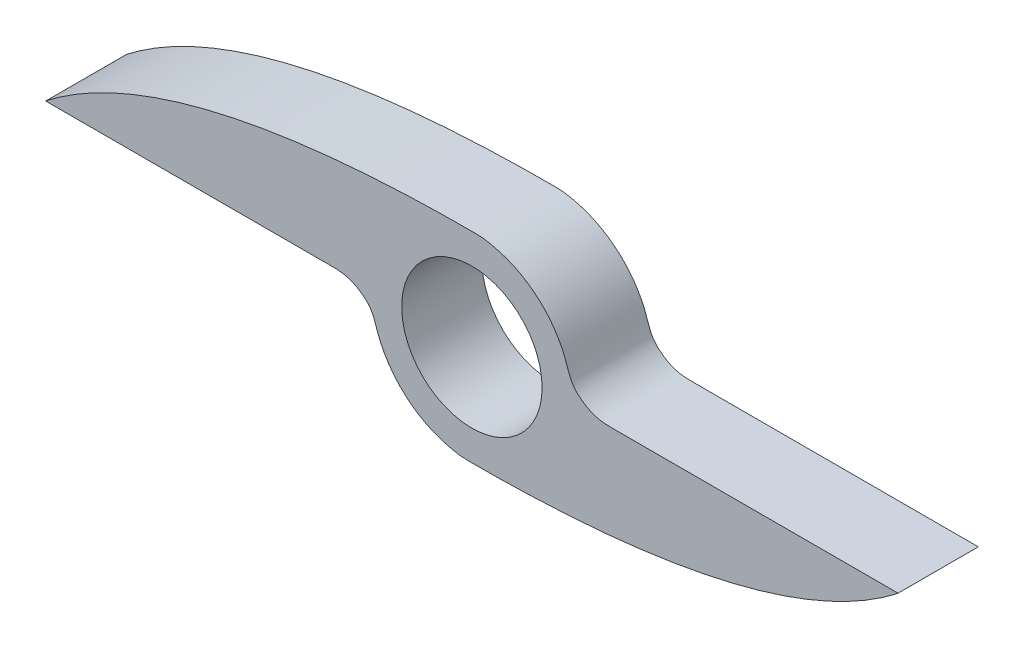
ISO-10303-21;
HEADER;
FILE_DESCRIPTION(('STEP AP214'),'2;1');
FILE_NAME('part.step','',(''),(''),'','','');
FILE_SCHEMA(('AUTOMOTIVE_DESIGN { 1 0 10303 214 1 1 1 1 }'));
ENDSEC;
DATA;
#1=APPLICATION_CONTEXT('core data for automotive mechanical design processes');
#2=APPLICATION_PROTOCOL_DEFINITION('international standard','automotive_design',2000,#1);
#3=PRODUCT_CONTEXT('',#1,'mechanical');
#4=PRODUCT('Part','Part','',(#3));
#5=PRODUCT_RELATED_PRODUCT_CATEGORY('part','',(#4));
#6=PRODUCT_DEFINITION_FORMATION('','',#4);
#7=PRODUCT_DEFINITION_CONTEXT('part definition',#1,'design');
#8=PRODUCT_DEFINITION('design','',#6,#7);
#9=PRODUCT_DEFINITION_SHAPE('','',#8);
#10=(LENGTH_UNIT() NAMED_UNIT(*) SI_UNIT(.MILLI.,.METRE.));
#11=(NAMED_UNIT(*) PLANE_ANGLE_UNIT() SI_UNIT($,.RADIAN.));
#12=(NAMED_UNIT(*) SI_UNIT($,.STERADIAN.) SOLID_ANGLE_UNIT());
#13=UNCERTAINTY_MEASURE_WITH_UNIT(LENGTH_MEASURE(1.E-05),#10,'distance_accuracy_value','');
#14=(GEOMETRIC_REPRESENTATION_CONTEXT(3) GLOBAL_UNCERTAINTY_ASSIGNED_CONTEXT((#13)) GLOBAL_UNIT_ASSIGNED_CONTEXT((#10,
#11,#12)) REPRESENTATION_CONTEXT('',''));
#15=CARTESIAN_POINT('',(0.,0.,0.));
#16=DIRECTION('',(0.,0.,1.));
#17=DIRECTION('',(1.,0.,0.));
#18=AXIS2_PLACEMENT_3D('',#15,#16,#17);
#19=CARTESIAN_POINT('',(9.63594669006627,-9.71107284735902,8.));
#20=DIRECTION('',(0.,0.,1.));
#21=DIRECTION('',(1.,0.,0.));
#22=AXIS2_PLACEMENT_3D('',#19,#20,#21);
#23=PLANE('',#22);
#24=CARTESIAN_POINT('',(14.142135623731,0.,8.));
#25=CARTESIAN_POINT('',(13.5006353246314,0.,8.));
#26=CARTESIAN_POINT('',(12.2176347264322,0.,8.));
#27=CARTESIAN_POINT('',(9.95319453694714,1.47774422345279,8.));
#28=CARTESIAN_POINT('',(9.64192384885385,2.72852105116465,8.));
#29=CARTESIAN_POINT('',(9.42809041582066,3.33333333333334,8.));
#30=CARTESIAN_POINT('',(8.36409396946859,6.34276974282908,8.));
#31=CARTESIAN_POINT('',(6.07108610465526,8.5633351826558,8.));
#32=CARTESIAN_POINT('',(3.02905446527688,9.53020613871423,8.));
#33=CARTESIAN_POINT('',(2.7211312622077,9.6280756013096,8.));
#34=CARTESIAN_POINT('',(2.0957982999656,9.7939673130377,8.));
#35=CARTESIAN_POINT('',(1.12842784904794,9.99491812636163,8.));
#36=CARTESIAN_POINT('',(0.482228104047284,9.99810923422188,8.));
#37=CARTESIAN_POINT('',(0.159126354532189,9.99873386000904,8.));
#38=CARTESIAN_POINT('',(-0.219270866943679,9.9994653839413,8.));
#39=CARTESIAN_POINT('',(-0.976070458801182,9.99826504438935,8.));
#40=CARTESIAN_POINT('',(-2.11129232253094,9.9884736441461,8.));
#41=CARTESIAN_POINT('',(-2.86800002715995,9.97661983438641,8.));
#42=CARTESIAN_POINT('',(-3.24632833513493,9.96936147832567,8.));
#43=CARTESIAN_POINT('',(-21.3392642967823,9.62224240574926,8.));
#44=CARTESIAN_POINT('',(-34.3900179574195,6.3256096826676,8.));
#45=CARTESIAN_POINT('',(-42.3985893170466,0.0794633090806813,8.));
#46=CARTESIAN_POINT('',(-42.4042332541701,0.075061418179808,8.));
#47=CARTESIAN_POINT('',(-42.4155178133287,0.0662533858976841,8.));
#48=CARTESIAN_POINT('',(-42.4324380326743,0.0530328280633104,8.));
#49=CARTESIAN_POINT('',(-42.4437059875938,0.0442035658651529,8.));
#50=CARTESIAN_POINT('',(-42.4493399650535,0.0397889347660742,8.));
#51=CARTESIAN_POINT('',(-42.4558003699556,0.0347267376597966,8.));
#52=CARTESIAN_POINT('',(-42.4687211797599,0.024602343447238,8.));
#53=CARTESIAN_POINT('',(-42.4117272195139,0.,8.));
#54=CARTESIAN_POINT('',(-42.3953122664476,0.,8.));
#55=CARTESIAN_POINT('',(-42.3871047899144,0.,8.));
#56=CARTESIAN_POINT('',(-32.9721150678533,0.,8.));
#57=CARTESIAN_POINT('',(-23.5571253457921,0.,8.));
#58=CARTESIAN_POINT('',(-14.1421356237309,0.,8.));
#59=CARTESIAN_POINT('',(-13.5006353246313,0.,8.));
#60=CARTESIAN_POINT('',(-12.2176347264322,0.,8.));
#61=CARTESIAN_POINT('',(-9.9531945369471,-1.47774422345279,8.));
#62=CARTESIAN_POINT('',(-9.6419238488538,-2.72852105116465,8.));
#63=CARTESIAN_POINT('',(-9.42809041582061,-3.33333333333333,8.));
#64=CARTESIAN_POINT('',(-8.36409396946854,-6.34276974282908,8.));
#65=CARTESIAN_POINT('',(-6.07108610465522,-8.56333518265578,8.));
#66=CARTESIAN_POINT('',(-3.02905446527684,-9.53020613871422,8.));
#67=CARTESIAN_POINT('',(-2.72113126220849,-9.62807560130933,8.));
#68=CARTESIAN_POINT('',(-2.09579829996811,-9.79396731303706,8.));
#69=CARTESIAN_POINT('',(-1.12842784905323,-9.99491812636158,8.));
#70=CARTESIAN_POINT('',(-0.482228104054318,-9.99810923422184,8.));
#71=CARTESIAN_POINT('',(-0.159126354540092,-9.99873386000902,8.));
#72=CARTESIAN_POINT('',(0.219270866936658,-9.9994653839413,8.));
#73=CARTESIAN_POINT('',(0.976070458795929,-9.99826504438937,8.));
#74=CARTESIAN_POINT('',(2.11129232252834,-9.98847364414614,8.));
#75=CARTESIAN_POINT('',(2.86800002715911,-9.97661983438642,8.));
#76=CARTESIAN_POINT('',(3.24632833513498,-9.96936147832567,8.));
#77=CARTESIAN_POINT('',(21.3392642967824,-9.62224240574926,8.));
#78=CARTESIAN_POINT('',(34.3900179574196,-6.32560968266759,8.));
#79=CARTESIAN_POINT('',(42.3985893170466,-0.0794633090806848,8.));
#80=CARTESIAN_POINT('',(42.4042332541702,-0.0750614181798098,8.));
#81=CARTESIAN_POINT('',(42.4155178133288,-0.0662533858976858,8.));
#82=CARTESIAN_POINT('',(42.4324380326744,-0.0530328280633104,8.));
#83=CARTESIAN_POINT('',(42.4437059875938,-0.0442035658651512,8.));
#84=CARTESIAN_POINT('',(42.4493399650536,-0.0397889347660725,8.));
#85=CARTESIAN_POINT('',(42.4558003699557,-0.0347267376597914,8.));
#86=CARTESIAN_POINT('',(42.4687211797599,-0.0246023434472328,8.));
#87=CARTESIAN_POINT('',(42.4117272195139,0.,8.));
#88=CARTESIAN_POINT('',(42.3953122664476,0.,8.));
#89=CARTESIAN_POINT('',(42.3871047899145,0.,8.));
#90=CARTESIAN_POINT('',(32.9721150678533,0.,8.));
#91=CARTESIAN_POINT('',(23.5571253457921,0.,8.));
#92=CARTESIAN_POINT('',(14.142135623731,0.,8.));
#93=(BOUNDED_CURVE() B_SPLINE_CURVE(3,(#24,#25,#26,#27,#28,#29,#30,#31,#32,#33,#34,#35,#36,#37,
#38,#39,#40,#41,#42,#43,#44,#45,#46,#47,#48,#49,#50,#51,#52,#53,#54,#55,#56,#57,#58,#59,#60,#61,
#62,#63,#64,#65,#66,#67,#68,#69,#70,#71,#72,#73,#74,#75,#76,#77,#78,#79,#80,#81,#82,#83,#84,#85,
#86,#87,#88,#89,#90,#91,#92),.UNSPECIFIED.,.T.,.F.) B_SPLINE_CURVE_WITH_KNOTS((4,1,1,3,3,1,1,3,
1,1,3,3,1,1,3,1,1,3,3,1,1,3,3,1,1,3,1,1,3,3,1,1,3,1,1,3,4),(0.,0.00549697130807569,
0.0109939426161514,0.0164909139242271,0.0419343516862862,0.0447029932100111,0.0474716347337361,
0.050240276257461,0.0534827417080891,0.0567252071587173,0.0599676726093454,0.215033308776197,
0.215142589278454,0.215251869780712,0.21536115028297,0.215486460740376,0.215611771197782,
0.215737081655187,0.359483660006853,0.36927798541021,0.379072310813568,0.388866636216926,
0.434200929385889,0.439134005163217,0.444067080940546,0.449000156717874,0.454777476618746,
0.460554796519619,0.466332116420492,0.742623043619905,0.742817756078706,0.743012468537508,
0.743207180996309,0.743430455109906,0.743653729223502,0.743877003337098,1.),
.UNSPECIFIED.) CURVE() GEOMETRIC_REPRESENTATION_ITEM() RATIONAL_B_SPLINE_CURVE((1.,1.,1.,1.,1.,
1.,0.930224451579998,0.930224451579998,1.,1.,1.,1.,1.,1.,1.,1.,1.,1.,1.,1.,1.,1.,1.,1.,1.,1.,1.,
1.,1.,1.,1.,1.,1.,1.,1.,1.,1.,1.,1.,1.,0.930224451579999,0.930224451579999,1.,1.,1.,1.,1.,1.,1.,
1.,1.,1.,1.,1.,1.,1.,1.,1.,1.,1.,1.,1.,1.,1.,1.,1.,1.,1.,1.)) REPRESENTATION_ITEM(''));
#94=CARTESIAN_POINT('',(14.142135623731,0.,8.));
#95=VERTEX_POINT('',#94);
#96=EDGE_CURVE('E10',#95,#95,#93,.T.);
#97=ORIENTED_EDGE('',*,*,#96,.T.);
#98=EDGE_LOOP('',(#97));
#99=FACE_BOUND('',#98,.T.);
#100=CARTESIAN_POINT('',(0.,0.,8.));
#101=DIRECTION('',(0.,0.,1.));
#102=DIRECTION('',(1.,0.,0.));
#103=AXIS2_PLACEMENT_3D('',#100,#101,#102);
#104=CIRCLE('',#103,7.);
#105=CARTESIAN_POINT('',(7.,0.,8.));
#106=VERTEX_POINT('',#105);
#107=EDGE_CURVE('E51',#106,#106,#104,.T.);
#108=ORIENTED_EDGE('',*,*,#107,.F.);
#109=EDGE_LOOP('',(#108));
#110=FACE_BOUND('',#109,.T.);
#111=ADVANCED_FACE('F38',(#99,#110),#23,.T.);
#112=CARTESIAN_POINT('',(9.63594669006627,-9.71107284735902,0.));
#113=DIRECTION('',(0.,0.,1.));
#114=DIRECTION('',(1.,0.,0.));
#115=AXIS2_PLACEMENT_3D('',#112,#113,#114);
#116=PLANE('',#115);
#117=CARTESIAN_POINT('',(14.142135623731,0.,0.));
#118=CARTESIAN_POINT('',(13.5006353246314,0.,0.));
#119=CARTESIAN_POINT('',(12.2176347264322,0.,0.));
#120=CARTESIAN_POINT('',(9.95319453694714,1.47774422345279,0.));
#121=CARTESIAN_POINT('',(9.64192384885385,2.72852105116465,0.));
#122=CARTESIAN_POINT('',(9.42809041582066,3.33333333333334,0.));
#123=CARTESIAN_POINT('',(8.36409396946859,6.34276974282908,0.));
#124=CARTESIAN_POINT('',(6.07108610465526,8.5633351826558,0.));
#125=CARTESIAN_POINT('',(3.02905446527688,9.53020613871423,0.));
#126=CARTESIAN_POINT('',(2.7211312622077,9.6280756013096,0.));
#127=CARTESIAN_POINT('',(2.0957982999656,9.7939673130377,0.));
#128=CARTESIAN_POINT('',(1.12842784904794,9.99491812636163,0.));
#129=CARTESIAN_POINT('',(0.482228104047284,9.99810923422188,0.));
#130=CARTESIAN_POINT('',(0.159126354532189,9.99873386000904,0.));
#131=CARTESIAN_POINT('',(-0.219270866943679,9.9994653839413,0.));
#132=CARTESIAN_POINT('',(-0.976070458801182,9.99826504438935,0.));
#133=CARTESIAN_POINT('',(-2.11129232253094,9.9884736441461,0.));
#134=CARTESIAN_POINT('',(-2.86800002715995,9.97661983438641,0.));
#135=CARTESIAN_POINT('',(-3.24632833513493,9.96936147832567,0.));
#136=CARTESIAN_POINT('',(-21.3392642967823,9.62224240574926,0.));
#137=CARTESIAN_POINT('',(-34.3900179574195,6.3256096826676,0.));
#138=CARTESIAN_POINT('',(-42.3985893170466,0.0794633090806813,0.));
#139=CARTESIAN_POINT('',(-42.4042332541701,0.075061418179808,0.));
#140=CARTESIAN_POINT('',(-42.4155178133287,0.0662533858976841,0.));
#141=CARTESIAN_POINT('',(-42.4324380326743,0.0530328280633104,0.));
#142=CARTESIAN_POINT('',(-42.4437059875938,0.0442035658651529,0.));
#143=CARTESIAN_POINT('',(-42.4493399650535,0.0397889347660742,0.));
#144=CARTESIAN_POINT('',(-42.4558003699556,0.0347267376597966,0.));
#145=CARTESIAN_POINT('',(-42.4687211797599,0.024602343447238,0.));
#146=CARTESIAN_POINT('',(-42.4117272195139,0.,0.));
#147=CARTESIAN_POINT('',(-42.3953122664476,0.,0.));
#148=CARTESIAN_POINT('',(-42.3871047899144,0.,0.));
#149=CARTESIAN_POINT('',(-32.9721150678533,0.,0.));
#150=CARTESIAN_POINT('',(-23.5571253457921,0.,0.));
#151=CARTESIAN_POINT('',(-14.1421356237309,0.,0.));
#152=CARTESIAN_POINT('',(-13.5006353246313,0.,0.));
#153=CARTESIAN_POINT('',(-12.2176347264322,0.,0.));
#154=CARTESIAN_POINT('',(-9.9531945369471,-1.47774422345279,0.));
#155=CARTESIAN_POINT('',(-9.6419238488538,-2.72852105116465,0.));
#156=CARTESIAN_POINT('',(-9.42809041582061,-3.33333333333333,0.));
#157=CARTESIAN_POINT('',(-8.36409396946854,-6.34276974282908,0.));
#158=CARTESIAN_POINT('',(-6.07108610465522,-8.56333518265578,0.));
#159=CARTESIAN_POINT('',(-3.02905446527684,-9.53020613871422,0.));
#160=CARTESIAN_POINT('',(-2.72113126220849,-9.62807560130933,0.));
#161=CARTESIAN_POINT('',(-2.09579829996811,-9.79396731303706,0.));
#162=CARTESIAN_POINT('',(-1.12842784905323,-9.99491812636158,0.));
#163=CARTESIAN_POINT('',(-0.482228104054318,-9.99810923422184,0.));
#164=CARTESIAN_POINT('',(-0.159126354540092,-9.99873386000902,0.));
#165=CARTESIAN_POINT('',(0.219270866936658,-9.9994653839413,0.));
#166=CARTESIAN_POINT('',(0.976070458795929,-9.99826504438937,0.));
#167=CARTESIAN_POINT('',(2.11129232252834,-9.98847364414614,0.));
#168=CARTESIAN_POINT('',(2.86800002715911,-9.97661983438642,0.));
#169=CARTESIAN_POINT('',(3.24632833513498,-9.96936147832567,0.));
#170=CARTESIAN_POINT('',(21.3392642967824,-9.62224240574926,0.));
#171=CARTESIAN_POINT('',(34.3900179574196,-6.32560968266759,0.));
#172=CARTESIAN_POINT('',(42.3985893170466,-0.0794633090806848,0.));
#173=CARTESIAN_POINT('',(42.4042332541702,-0.0750614181798098,0.));
#174=CARTESIAN_POINT('',(42.4155178133288,-0.0662533858976858,0.));
#175=CARTESIAN_POINT('',(42.4324380326744,-0.0530328280633104,0.));
#176=CARTESIAN_POINT('',(42.4437059875938,-0.0442035658651512,0.));
#177=CARTESIAN_POINT('',(42.4493399650536,-0.0397889347660725,0.));
#178=CARTESIAN_POINT('',(42.4558003699557,-0.0347267376597914,0.));
#179=CARTESIAN_POINT('',(42.4687211797599,-0.0246023434472328,0.));
#180=CARTESIAN_POINT('',(42.4117272195139,0.,0.));
#181=CARTESIAN_POINT('',(42.3953122664476,0.,0.));
#182=CARTESIAN_POINT('',(42.3871047899145,0.,0.));
#183=CARTESIAN_POINT('',(32.9721150678533,0.,0.));
#184=CARTESIAN_POINT('',(23.5571253457921,0.,0.));
#185=CARTESIAN_POINT('',(14.142135623731,0.,0.));
#186=(BOUNDED_CURVE() B_SPLINE_CURVE(3,(#117,#118,#119,#120,#121,#122,#123,#124,#125,#126,#127,
#128,#129,#130,#131,#132,#133,#134,#135,#136,#137,#138,#139,#140,#141,#142,#143,#144,#145,#146,
#147,#148,#149,#150,#151,#152,#153,#154,#155,#156,#157,#158,#159,#160,#161,#162,#163,#164,#165,
#166,#167,#168,#169,#170,#171,#172,#173,#174,#175,#176,#177,#178,#179,#180,#181,#182,#183,#184,
#185),.UNSPECIFIED.,.T.,.F.) B_SPLINE_CURVE_WITH_KNOTS((4,1,1,3,3,1,1,3,1,1,3,3,1,1,3,1,1,3,3,1,
1,3,3,1,1,3,1,1,3,3,1,1,3,1,1,3,4),(0.,0.00549697130807569,0.0109939426161514,
0.0164909139242271,0.0419343516862862,0.0447029932100111,0.0474716347337361,0.050240276257461,
0.0534827417080891,0.0567252071587173,0.0599676726093454,0.215033308776197,0.215142589278454,
0.215251869780712,0.21536115028297,0.215486460740376,0.215611771197782,0.215737081655187,
0.359483660006853,0.36927798541021,0.379072310813568,0.388866636216926,0.434200929385889,
0.439134005163217,0.444067080940546,0.449000156717874,0.454777476618746,0.460554796519619,
0.466332116420492,0.742623043619905,0.742817756078706,0.743012468537508,0.743207180996309,
0.743430455109906,0.743653729223502,0.743877003337098,1.),
.UNSPECIFIED.) CURVE() GEOMETRIC_REPRESENTATION_ITEM() RATIONAL_B_SPLINE_CURVE((1.,1.,1.,1.,1.,
1.,0.930224451579998,0.930224451579998,1.,1.,1.,1.,1.,1.,1.,1.,1.,1.,1.,1.,1.,1.,1.,1.,1.,1.,1.,
1.,1.,1.,1.,1.,1.,1.,1.,1.,1.,1.,1.,1.,0.930224451579999,0.930224451579999,1.,1.,1.,1.,1.,1.,1.,
1.,1.,1.,1.,1.,1.,1.,1.,1.,1.,1.,1.,1.,1.,1.,1.,1.,1.,1.,1.)) REPRESENTATION_ITEM(''));
#187=CARTESIAN_POINT('',(14.142135623731,0.,0.));
#188=VERTEX_POINT('',#187);
#189=EDGE_CURVE('E43',#188,#188,#186,.T.);
#190=ORIENTED_EDGE('',*,*,#189,.F.);
#191=EDGE_LOOP('',(#190));
#192=FACE_BOUND('',#191,.T.);
#193=CARTESIAN_POINT('',(0.,0.,0.));
#194=DIRECTION('',(0.,0.,1.));
#195=DIRECTION('',(1.,0.,0.));
#196=AXIS2_PLACEMENT_3D('',#193,#194,#195);
#197=CIRCLE('',#196,7.);
#198=CARTESIAN_POINT('',(7.,0.,0.));
#199=VERTEX_POINT('',#198);
#200=EDGE_CURVE('E56',#199,#199,#197,.T.);
#201=ORIENTED_EDGE('',*,*,#200,.T.);
#202=EDGE_LOOP('',(#201));
#203=FACE_BOUND('',#202,.T.);
#204=ADVANCED_FACE('F69',(#192,#203),#116,.F.);
#205=DIRECTION('',(0.,0.,-1.));
#206=VECTOR('',#205,1.);
#207=SURFACE_OF_LINEAR_EXTRUSION('',#93,#206);
#208=ORIENTED_EDGE('',*,*,#96,.F.);
#209=EDGE_LOOP('',(#208));
#210=FACE_BOUND('',#209,.T.);
#211=ORIENTED_EDGE('',*,*,#189,.T.);
#212=EDGE_LOOP('',(#211));
#213=FACE_BOUND('',#212,.T.);
#214=ADVANCED_FACE('F40',(#210,#213),#207,.F.);
#215=CARTESIAN_POINT('',(0.,0.,8.));
#216=DIRECTION('',(0.,0.,-1.));
#217=DIRECTION('',(-1.,0.,0.));
#218=AXIS2_PLACEMENT_3D('',#215,#216,#217);
#219=CYLINDRICAL_SURFACE('',#218,7.);
#220=ORIENTED_EDGE('',*,*,#107,.T.);
#221=EDGE_LOOP('',(#220));
#222=FACE_BOUND('',#221,.T.);
#223=ORIENTED_EDGE('',*,*,#200,.F.);
#224=EDGE_LOOP('',(#223));
#225=FACE_BOUND('',#224,.T.);
#226=ADVANCED_FACE('F65',(#222,#225),#219,.F.);
#227=CLOSED_SHELL('',(#111,#204,#214,#226));
#228=MANIFOLD_SOLID_BREP('B2',#227);
#229=ADVANCED_BREP_SHAPE_REPRESENTATION('',(#18,#228),#14);
#230=SHAPE_DEFINITION_REPRESENTATION(#9,#229);
ENDSEC;
END-ISO-10303-21;
